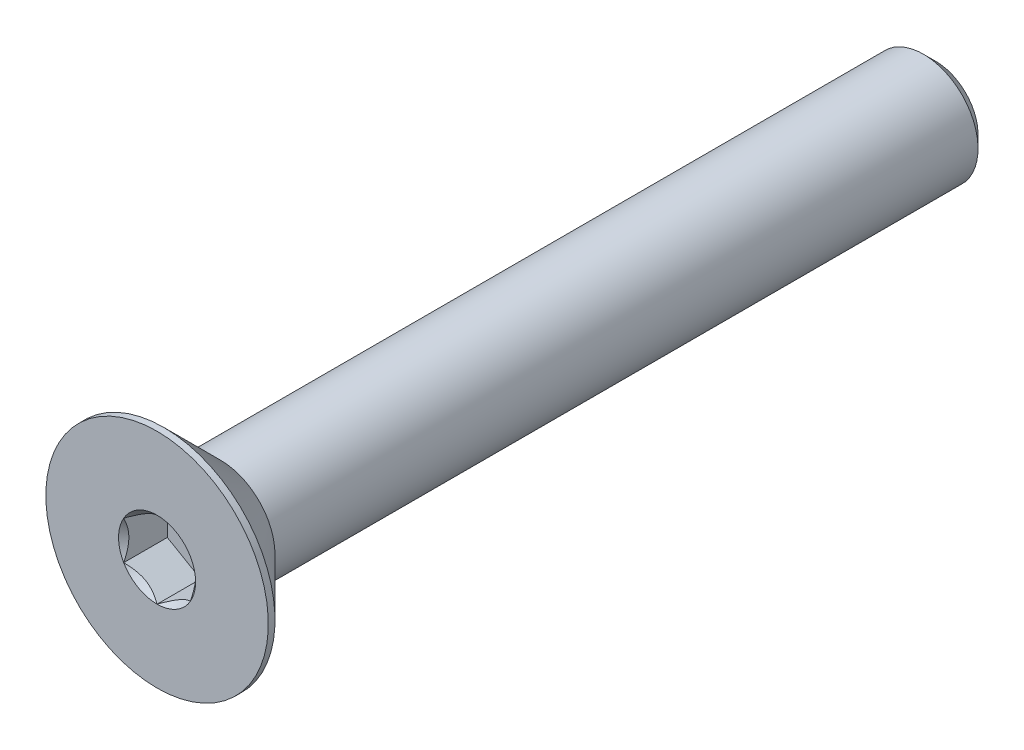
ISO-10303-21;
HEADER;
FILE_DESCRIPTION(('STEP AP214'),'2;1');
FILE_NAME('part.step','',(''),(''),'','','');
FILE_SCHEMA(('AUTOMOTIVE_DESIGN { 1 0 10303 214 1 1 1 1 }'));
ENDSEC;
DATA;
#1=APPLICATION_CONTEXT('core data for automotive mechanical design processes');
#2=APPLICATION_PROTOCOL_DEFINITION('international standard','automotive_design',2000,#1);
#3=PRODUCT_CONTEXT('',#1,'mechanical');
#4=PRODUCT('Part','Part','',(#3));
#5=PRODUCT_RELATED_PRODUCT_CATEGORY('part','',(#4));
#6=PRODUCT_DEFINITION_FORMATION('','',#4);
#7=PRODUCT_DEFINITION_CONTEXT('part definition',#1,'design');
#8=PRODUCT_DEFINITION('design','',#6,#7);
#9=PRODUCT_DEFINITION_SHAPE('','',#8);
#10=(LENGTH_UNIT() NAMED_UNIT(*) SI_UNIT(.MILLI.,.METRE.));
#11=(NAMED_UNIT(*) PLANE_ANGLE_UNIT() SI_UNIT($,.RADIAN.));
#12=(NAMED_UNIT(*) SI_UNIT($,.STERADIAN.) SOLID_ANGLE_UNIT());
#13=UNCERTAINTY_MEASURE_WITH_UNIT(LENGTH_MEASURE(1.E-05),#10,'distance_accuracy_value','');
#14=(GEOMETRIC_REPRESENTATION_CONTEXT(3) GLOBAL_UNCERTAINTY_ASSIGNED_CONTEXT((#13)) GLOBAL_UNIT_ASSIGNED_CONTEXT((#10,
#11,#12)) REPRESENTATION_CONTEXT('',''));
#15=CARTESIAN_POINT('',(0.,0.,0.));
#16=DIRECTION('',(0.,0.,1.));
#17=DIRECTION('',(1.,0.,0.));
#18=AXIS2_PLACEMENT_3D('',#15,#16,#17);
#19=CARTESIAN_POINT('',(0.,-1.73205080756888,-1.96));
#20=DIRECTION('',(0.5,-0.866025403784439,0.));
#21=DIRECTION('',(0.,0.,-1.));
#22=AXIS2_PLACEMENT_3D('',#19,#20,#21);
#23=PLANE('',#22);
#24=DIRECTION('',(0.,0.,1.));
#25=VECTOR('',#24,1.);
#26=CARTESIAN_POINT('',(0.,-1.73205080756888,-1.96));
#27=LINE('',#26,#25);
#28=CARTESIAN_POINT('',(0.,-1.73205080756888,-1.96));
#29=VERTEX_POINT('',#28);
#30=CARTESIAN_POINT('',(0.,-1.73205080756888,0.));
#31=VERTEX_POINT('',#30);
#32=EDGE_CURVE('E11',#29,#31,#27,.T.);
#33=ORIENTED_EDGE('',*,*,#32,.T.);
#34=CARTESIAN_POINT('',(0.,-1.73205080756888,0.));
#35=CARTESIAN_POINT('',(0.749999999999999,-1.29903810567666,-0.433012701892219));
#36=CARTESIAN_POINT('',(1.5,-0.86602540378444,0.));
#37=(BOUNDED_CURVE() B_SPLINE_CURVE(2,(#34,#35,#36),.UNSPECIFIED.,.F.,
.F.) B_SPLINE_CURVE_WITH_KNOTS((3,3),(-0.388312804292311,-0.130611113351457),
.UNSPECIFIED.) CURVE() GEOMETRIC_REPRESENTATION_ITEM() RATIONAL_B_SPLINE_CURVE((1.3094010767585,
1.51196612828742,1.3094010767585)) REPRESENTATION_ITEM(''));
#38=CARTESIAN_POINT('',(1.5,-0.86602540378444,0.));
#39=VERTEX_POINT('',#38);
#40=EDGE_CURVE('E161',#31,#39,#37,.T.);
#41=ORIENTED_EDGE('',*,*,#40,.T.);
#42=DIRECTION('',(0.,0.,1.));
#43=VECTOR('',#42,1.);
#44=CARTESIAN_POINT('',(1.5,-0.866025403784439,-1.96));
#45=LINE('',#44,#43);
#46=CARTESIAN_POINT('',(1.5,-0.866025403784439,-1.96));
#47=VERTEX_POINT('',#46);
#48=EDGE_CURVE('E84',#47,#39,#45,.T.);
#49=ORIENTED_EDGE('',*,*,#48,.F.);
#50=DIRECTION('',(0.866025403784439,0.5,0.));
#51=VECTOR('',#50,1.);
#52=CARTESIAN_POINT('',(0.,-1.73205080756888,-1.96));
#53=LINE('',#52,#51);
#54=EDGE_CURVE('E156',#29,#47,#53,.T.);
#55=ORIENTED_EDGE('',*,*,#54,.F.);
#56=EDGE_LOOP('',(#33,#41,#49,#55));
#57=FACE_BOUND('',#56,.T.);
#58=ADVANCED_FACE('F17',(#57),#23,.F.);
#59=CARTESIAN_POINT('',(-1.5,-0.866025403784438,-1.96));
#60=DIRECTION('',(-0.5,-0.866025403784439,0.));
#61=DIRECTION('',(-0.866025403784439,0.5,0.));
#62=AXIS2_PLACEMENT_3D('',#59,#60,#61);
#63=PLANE('',#62);
#64=DIRECTION('',(0.,0.,1.));
#65=VECTOR('',#64,1.);
#66=CARTESIAN_POINT('',(-1.5,-0.866025403784438,-1.96));
#67=LINE('',#66,#65);
#68=CARTESIAN_POINT('',(-1.5,-0.866025403784438,-1.96));
#69=VERTEX_POINT('',#68);
#70=CARTESIAN_POINT('',(-1.5,-0.866025403784438,0.));
#71=VERTEX_POINT('',#70);
#72=EDGE_CURVE('E29',#69,#71,#67,.T.);
#73=ORIENTED_EDGE('',*,*,#72,.T.);
#74=CARTESIAN_POINT('',(-1.5,-0.86602540378444,0.));
#75=CARTESIAN_POINT('',(-0.749999999999999,-1.29903810567666,-0.433012701892218));
#76=CARTESIAN_POINT('',(0.,-1.73205080756888,0.));
#77=(BOUNDED_CURVE() B_SPLINE_CURVE(2,(#74,#75,#76),.UNSPECIFIED.,.F.,
.F.) B_SPLINE_CURVE_WITH_KNOTS((3,3),(-0.388312804292311,-0.130611113351457),
.UNSPECIFIED.) CURVE() GEOMETRIC_REPRESENTATION_ITEM() RATIONAL_B_SPLINE_CURVE((1.3094010767585,
1.51196612828742,1.3094010767585)) REPRESENTATION_ITEM(''));
#78=EDGE_CURVE('E176',#71,#31,#77,.T.);
#79=ORIENTED_EDGE('',*,*,#78,.T.);
#80=ORIENTED_EDGE('',*,*,#32,.F.);
#81=DIRECTION('',(0.866025403784439,-0.5,0.));
#82=VECTOR('',#81,1.);
#83=CARTESIAN_POINT('',(-1.5,-0.866025403784438,-1.96));
#84=LINE('',#83,#82);
#85=EDGE_CURVE('E171',#69,#29,#84,.T.);
#86=ORIENTED_EDGE('',*,*,#85,.F.);
#87=EDGE_LOOP('',(#73,#79,#80,#86));
#88=FACE_BOUND('',#87,.T.);
#89=ADVANCED_FACE('F288',(#88),#63,.F.);
#90=CARTESIAN_POINT('',(-1.5,0.866025403784439,-1.96));
#91=DIRECTION('',(-1.,0.,0.));
#92=DIRECTION('',(0.,0.,1.));
#93=AXIS2_PLACEMENT_3D('',#90,#91,#92);
#94=PLANE('',#93);
#95=DIRECTION('',(0.,0.,1.));
#96=VECTOR('',#95,1.);
#97=CARTESIAN_POINT('',(-1.5,0.866025403784439,-1.96));
#98=LINE('',#97,#96);
#99=CARTESIAN_POINT('',(-1.5,0.866025403784439,-1.96));
#100=VERTEX_POINT('',#99);
#101=CARTESIAN_POINT('',(-1.5,0.86602540378444,0.));
#102=VERTEX_POINT('',#101);
#103=EDGE_CURVE('E198',#100,#102,#98,.T.);
#104=ORIENTED_EDGE('',*,*,#103,.T.);
#105=CARTESIAN_POINT('',(-1.5,0.866025403784437,0.));
#106=CARTESIAN_POINT('',(-1.5,0.,-0.433012701892218));
#107=CARTESIAN_POINT('',(-1.5,-0.866025403784438,0.));
#108=(BOUNDED_CURVE() B_SPLINE_CURVE(2,(#105,#106,#107),.UNSPECIFIED.,.F.,
.F.) B_SPLINE_CURVE_WITH_KNOTS((3,3),(-0.388312804292311,-0.130611113351457),
.UNSPECIFIED.) CURVE() GEOMETRIC_REPRESENTATION_ITEM() RATIONAL_B_SPLINE_CURVE((1.3094010767585,
1.51196612828742,1.3094010767585)) REPRESENTATION_ITEM(''));
#109=EDGE_CURVE('E210',#102,#71,#108,.T.);
#110=ORIENTED_EDGE('',*,*,#109,.T.);
#111=ORIENTED_EDGE('',*,*,#72,.F.);
#112=DIRECTION('',(0.,-1.,0.));
#113=VECTOR('',#112,1.);
#114=CARTESIAN_POINT('',(-1.5,0.866025403784439,-1.96));
#115=LINE('',#114,#113);
#116=EDGE_CURVE('E167',#100,#69,#115,.T.);
#117=ORIENTED_EDGE('',*,*,#116,.F.);
#118=EDGE_LOOP('',(#104,#110,#111,#117));
#119=FACE_BOUND('',#118,.T.);
#120=ADVANCED_FACE('F312',(#119),#94,.F.);
#121=CARTESIAN_POINT('',(0.,1.73205080756888,-1.96));
#122=DIRECTION('',(-0.5,0.866025403784439,0.));
#123=DIRECTION('',(0.,0.,1.));
#124=AXIS2_PLACEMENT_3D('',#121,#122,#123);
#125=PLANE('',#124);
#126=DIRECTION('',(0.,0.,1.));
#127=VECTOR('',#126,1.);
#128=CARTESIAN_POINT('',(0.,1.73205080756888,-1.96));
#129=LINE('',#128,#127);
#130=CARTESIAN_POINT('',(0.,1.73205080756888,-1.96));
#131=VERTEX_POINT('',#130);
#132=CARTESIAN_POINT('',(0.,1.73205080756888,0.));
#133=VERTEX_POINT('',#132);
#134=EDGE_CURVE('E201',#131,#133,#129,.T.);
#135=ORIENTED_EDGE('',*,*,#134,.T.);
#136=CARTESIAN_POINT('',(0.,1.73205080756888,0.));
#137=CARTESIAN_POINT('',(-0.75,1.29903810567666,-0.433012701892217));
#138=CARTESIAN_POINT('',(-1.5,0.86602540378444,0.));
#139=(BOUNDED_CURVE() B_SPLINE_CURVE(2,(#136,#137,#138),.UNSPECIFIED.,.F.,
.F.) B_SPLINE_CURVE_WITH_KNOTS((3,3),(-0.388312804292311,-0.130611113351457),
.UNSPECIFIED.) CURVE() GEOMETRIC_REPRESENTATION_ITEM() RATIONAL_B_SPLINE_CURVE((1.3094010767585,
1.51196612828741,1.3094010767585)) REPRESENTATION_ITEM(''));
#140=EDGE_CURVE('E204',#133,#102,#139,.T.);
#141=ORIENTED_EDGE('',*,*,#140,.T.);
#142=ORIENTED_EDGE('',*,*,#103,.F.);
#143=DIRECTION('',(-0.866025403784439,-0.5,0.));
#144=VECTOR('',#143,1.);
#145=CARTESIAN_POINT('',(0.,1.73205080756888,-1.96));
#146=LINE('',#145,#144);
#147=EDGE_CURVE('E166',#131,#100,#146,.T.);
#148=ORIENTED_EDGE('',*,*,#147,.F.);
#149=EDGE_LOOP('',(#135,#141,#142,#148));
#150=FACE_BOUND('',#149,.T.);
#151=ADVANCED_FACE('F310',(#150),#125,.F.);
#152=CARTESIAN_POINT('',(1.5,0.866025403784439,-1.96));
#153=DIRECTION('',(0.5,0.866025403784439,0.));
#154=DIRECTION('',(0.,0.,-1.));
#155=AXIS2_PLACEMENT_3D('',#152,#153,#154);
#156=PLANE('',#155);
#157=DIRECTION('',(0.,0.,1.));
#158=VECTOR('',#157,1.);
#159=CARTESIAN_POINT('',(1.5,0.866025403784439,-1.96));
#160=LINE('',#159,#158);
#161=CARTESIAN_POINT('',(1.5,0.866025403784439,-1.96));
#162=VERTEX_POINT('',#161);
#163=CARTESIAN_POINT('',(1.5,0.866025403784439,0.));
#164=VERTEX_POINT('',#163);
#165=EDGE_CURVE('E95',#162,#164,#160,.T.);
#166=ORIENTED_EDGE('',*,*,#165,.T.);
#167=CARTESIAN_POINT('',(1.5,0.86602540378444,0.));
#168=CARTESIAN_POINT('',(0.749999999999999,1.29903810567666,-0.433012701892218));
#169=CARTESIAN_POINT('',(0.,1.73205080756888,0.));
#170=(BOUNDED_CURVE() B_SPLINE_CURVE(2,(#167,#168,#169),.UNSPECIFIED.,.F.,
.F.) B_SPLINE_CURVE_WITH_KNOTS((3,3),(-0.388312804292311,-0.130611113351457),
.UNSPECIFIED.) CURVE() GEOMETRIC_REPRESENTATION_ITEM() RATIONAL_B_SPLINE_CURVE((1.3094010767585,
1.51196612828742,1.3094010767585)) REPRESENTATION_ITEM(''));
#171=EDGE_CURVE('E20',#164,#133,#170,.T.);
#172=ORIENTED_EDGE('',*,*,#171,.T.);
#173=ORIENTED_EDGE('',*,*,#134,.F.);
#174=DIRECTION('',(-0.866025403784439,0.5,0.));
#175=VECTOR('',#174,1.);
#176=CARTESIAN_POINT('',(1.5,0.866025403784439,-1.96));
#177=LINE('',#176,#175);
#178=EDGE_CURVE('E162',#162,#131,#177,.T.);
#179=ORIENTED_EDGE('',*,*,#178,.F.);
#180=EDGE_LOOP('',(#166,#172,#173,#179));
#181=FACE_BOUND('',#180,.T.);
#182=ADVANCED_FACE('F305',(#181),#156,.F.);
#183=CARTESIAN_POINT('',(1.5,-0.866025403784439,-1.96));
#184=DIRECTION('',(1.,0.,0.));
#185=DIRECTION('',(0.,-1.,0.));
#186=AXIS2_PLACEMENT_3D('',#183,#184,#185);
#187=PLANE('',#186);
#188=ORIENTED_EDGE('',*,*,#48,.T.);
#189=CARTESIAN_POINT('',(1.5,-0.866025403784438,0.));
#190=CARTESIAN_POINT('',(1.5,0.,-0.433012701892218));
#191=CARTESIAN_POINT('',(1.5,0.86602540378444,0.));
#192=(BOUNDED_CURVE() B_SPLINE_CURVE(2,(#189,#190,#191),.UNSPECIFIED.,.F.,
.F.) B_SPLINE_CURVE_WITH_KNOTS((3,3),(-0.388312804292311,-0.130611113351457),
.UNSPECIFIED.) CURVE() GEOMETRIC_REPRESENTATION_ITEM() RATIONAL_B_SPLINE_CURVE((1.3094010767585,
1.51196612828742,1.3094010767585)) REPRESENTATION_ITEM(''));
#193=EDGE_CURVE('E142',#39,#164,#192,.T.);
#194=ORIENTED_EDGE('',*,*,#193,.T.);
#195=ORIENTED_EDGE('',*,*,#165,.F.);
#196=DIRECTION('',(0.,1.,0.));
#197=VECTOR('',#196,1.);
#198=CARTESIAN_POINT('',(1.5,-0.866025403784439,-1.96));
#199=LINE('',#198,#197);
#200=EDGE_CURVE('E160',#47,#162,#199,.T.);
#201=ORIENTED_EDGE('',*,*,#200,.F.);
#202=EDGE_LOOP('',(#188,#194,#195,#201));
#203=FACE_BOUND('',#202,.T.);
#204=ADVANCED_FACE('F302',(#203),#187,.F.);
#205=CARTESIAN_POINT('',(1.5,-0.866025403784438,-1.96));
#206=DIRECTION('',(0.,0.,1.));
#207=DIRECTION('',(1.,0.,0.));
#208=AXIS2_PLACEMENT_3D('',#205,#206,#207);
#209=PLANE('',#208);
#210=ORIENTED_EDGE('',*,*,#54,.T.);
#211=ORIENTED_EDGE('',*,*,#200,.T.);
#212=ORIENTED_EDGE('',*,*,#178,.T.);
#213=ORIENTED_EDGE('',*,*,#147,.T.);
#214=ORIENTED_EDGE('',*,*,#116,.T.);
#215=ORIENTED_EDGE('',*,*,#85,.T.);
#216=EDGE_LOOP('',(#210,#211,#212,#213,#214,#215));
#217=FACE_BOUND('',#216,.T.);
#218=ADVANCED_FACE('F280',(#217),#209,.T.);
#219=CARTESIAN_POINT('',(0.,0.,0.));
#220=DIRECTION('',(0.,0.,1.));
#221=DIRECTION('',(1.,0.,0.));
#222=AXIS2_PLACEMENT_3D('',#219,#220,#221);
#223=CONICAL_SURFACE('',#222,1.73205080756888,0.78539816339745);
#224=CARTESIAN_POINT('',(0.,0.,0.));
#225=DIRECTION('',(0.,0.,1.));
#226=DIRECTION('',(1.,0.,0.));
#227=AXIS2_PLACEMENT_3D('',#224,#225,#226);
#228=CIRCLE('',#227,1.73205080756888);
#229=EDGE_CURVE('E132',#31,#39,#228,.T.);
#230=ORIENTED_EDGE('',*,*,#229,.T.);
#231=ORIENTED_EDGE('',*,*,#40,.F.);
#232=EDGE_LOOP('',(#230,#231));
#233=FACE_BOUND('',#232,.T.);
#234=ADVANCED_FACE('F284',(#233),#223,.F.);
#235=CARTESIAN_POINT('',(0.,0.,0.));
#236=DIRECTION('',(0.,0.,1.));
#237=DIRECTION('',(1.,0.,0.));
#238=AXIS2_PLACEMENT_3D('',#235,#236,#237);
#239=CONICAL_SURFACE('',#238,1.73205080756888,0.78539816339745);
#240=CARTESIAN_POINT('',(0.,0.,0.));
#241=DIRECTION('',(0.,0.,1.));
#242=DIRECTION('',(1.,0.,0.));
#243=AXIS2_PLACEMENT_3D('',#240,#241,#242);
#244=CIRCLE('',#243,1.73205080756888);
#245=EDGE_CURVE('E190',#71,#31,#244,.T.);
#246=ORIENTED_EDGE('',*,*,#245,.T.);
#247=ORIENTED_EDGE('',*,*,#78,.F.);
#248=EDGE_LOOP('',(#246,#247));
#249=FACE_BOUND('',#248,.T.);
#250=ADVANCED_FACE('F291',(#249),#239,.F.);
#251=CARTESIAN_POINT('',(0.,0.,0.));
#252=DIRECTION('',(0.,0.,1.));
#253=DIRECTION('',(-1.,0.,0.));
#254=AXIS2_PLACEMENT_3D('',#251,#252,#253);
#255=CONICAL_SURFACE('',#254,1.73205080756888,0.78539816339745);
#256=CARTESIAN_POINT('',(0.,0.,0.));
#257=DIRECTION('',(0.,0.,1.));
#258=DIRECTION('',(1.,0.,0.));
#259=AXIS2_PLACEMENT_3D('',#256,#257,#258);
#260=CIRCLE('',#259,1.73205080756888);
#261=EDGE_CURVE('E185',#102,#71,#260,.T.);
#262=ORIENTED_EDGE('',*,*,#261,.T.);
#263=ORIENTED_EDGE('',*,*,#109,.F.);
#264=EDGE_LOOP('',(#262,#263));
#265=FACE_BOUND('',#264,.T.);
#266=ADVANCED_FACE('F393',(#265),#255,.F.);
#267=CARTESIAN_POINT('',(0.,0.,0.));
#268=DIRECTION('',(0.,0.,1.));
#269=DIRECTION('',(1.,0.,0.));
#270=AXIS2_PLACEMENT_3D('',#267,#268,#269);
#271=CONICAL_SURFACE('',#270,1.73205080756888,0.78539816339745);
#272=CARTESIAN_POINT('',(0.,0.,0.));
#273=DIRECTION('',(0.,0.,1.));
#274=DIRECTION('',(1.,0.,0.));
#275=AXIS2_PLACEMENT_3D('',#272,#273,#274);
#276=CIRCLE('',#275,1.73205080756888);
#277=EDGE_CURVE('E189',#133,#102,#276,.T.);
#278=ORIENTED_EDGE('',*,*,#277,.T.);
#279=ORIENTED_EDGE('',*,*,#140,.F.);
#280=EDGE_LOOP('',(#278,#279));
#281=FACE_BOUND('',#280,.T.);
#282=ADVANCED_FACE('F403',(#281),#271,.F.);
#283=CARTESIAN_POINT('',(0.,0.,0.));
#284=DIRECTION('',(0.,0.,1.));
#285=DIRECTION('',(1.,0.,0.));
#286=AXIS2_PLACEMENT_3D('',#283,#284,#285);
#287=CONICAL_SURFACE('',#286,1.73205080756888,0.78539816339745);
#288=CARTESIAN_POINT('',(0.,0.,0.));
#289=DIRECTION('',(0.,0.,1.));
#290=DIRECTION('',(1.,0.,0.));
#291=AXIS2_PLACEMENT_3D('',#288,#289,#290);
#292=CIRCLE('',#291,1.73205080756888);
#293=EDGE_CURVE('E154',#164,#133,#292,.T.);
#294=ORIENTED_EDGE('',*,*,#293,.T.);
#295=ORIENTED_EDGE('',*,*,#171,.F.);
#296=EDGE_LOOP('',(#294,#295));
#297=FACE_BOUND('',#296,.T.);
#298=ADVANCED_FACE('F414',(#297),#287,.F.);
#299=CARTESIAN_POINT('',(0.,-2.5,0.));
#300=DIRECTION('',(0.,0.,1.));
#301=DIRECTION('',(0.,-1.,0.));
#302=AXIS2_PLACEMENT_3D('',#299,#300,#301);
#303=PLANE('',#302);
#304=ORIENTED_EDGE('',*,*,#229,.F.);
#305=ORIENTED_EDGE('',*,*,#245,.F.);
#306=ORIENTED_EDGE('',*,*,#261,.F.);
#307=ORIENTED_EDGE('',*,*,#277,.F.);
#308=ORIENTED_EDGE('',*,*,#293,.F.);
#309=CARTESIAN_POINT('',(0.,0.,0.));
#310=DIRECTION('',(0.,0.,1.));
#311=DIRECTION('',(1.,0.,0.));
#312=AXIS2_PLACEMENT_3D('',#309,#310,#311);
#313=CIRCLE('',#312,1.73205080756888);
#314=EDGE_CURVE('E149',#39,#164,#313,.T.);
#315=ORIENTED_EDGE('',*,*,#314,.F.);
#316=EDGE_LOOP('',(#304,#305,#306,#307,#308,#315));
#317=FACE_BOUND('',#316,.T.);
#318=CARTESIAN_POINT('',(0.,0.,0.));
#319=DIRECTION('',(0.,0.,1.));
#320=DIRECTION('',(0.,-1.,0.));
#321=AXIS2_PLACEMENT_3D('',#318,#319,#320);
#322=CIRCLE('',#321,5.);
#323=CARTESIAN_POINT('',(0.,5.,0.));
#324=VERTEX_POINT('',#323);
#325=EDGE_CURVE('E130',#324,#324,#322,.T.);
#326=ORIENTED_EDGE('',*,*,#325,.T.);
#327=EDGE_LOOP('',(#326));
#328=FACE_BOUND('',#327,.T.);
#329=ADVANCED_FACE('F294',(#317,#328),#303,.T.);
#330=CARTESIAN_POINT('',(0.,-2.5,-35.));
#331=DIRECTION('',(0.,0.,-1.));
#332=DIRECTION('',(0.,-1.,0.));
#333=AXIS2_PLACEMENT_3D('',#330,#331,#332);
#334=PLANE('',#333);
#335=CARTESIAN_POINT('',(0.,0.,-35.));
#336=DIRECTION('',(0.,0.,-1.));
#337=DIRECTION('',(1.,0.,0.));
#338=AXIS2_PLACEMENT_3D('',#335,#336,#337);
#339=CIRCLE('',#338,1.9);
#340=CARTESIAN_POINT('',(-1.9,0.,-35.));
#341=VERTEX_POINT('',#340);
#342=EDGE_CURVE('E246',#341,#341,#339,.T.);
#343=ORIENTED_EDGE('',*,*,#342,.T.);
#344=EDGE_LOOP('',(#343));
#345=FACE_BOUND('',#344,.T.);
#346=ADVANCED_FACE('F435',(#345),#334,.T.);
#347=CARTESIAN_POINT('',(0.,0.,0.));
#348=DIRECTION('',(0.,0.,1.));
#349=DIRECTION('',(0.,-1.,0.));
#350=AXIS2_PLACEMENT_3D('',#347,#348,#349);
#351=CYLINDRICAL_SURFACE('',#350,5.);
#352=ORIENTED_EDGE('',*,*,#325,.F.);
#353=DIRECTION('',(0.,0.,-1.));
#354=VECTOR('',#353,1.);
#355=CARTESIAN_POINT('',(0.,5.,0.));
#356=LINE('',#355,#354);
#357=CARTESIAN_POINT('',(0.,5.,-0.300000000000012));
#358=VERTEX_POINT('',#357);
#359=EDGE_CURVE('E124',#324,#358,#356,.T.);
#360=ORIENTED_EDGE('',*,*,#359,.T.);
#361=CARTESIAN_POINT('',(0.,0.,-0.300000000000008));
#362=DIRECTION('',(0.,0.,1.));
#363=DIRECTION('',(0.,-1.,0.));
#364=AXIS2_PLACEMENT_3D('',#361,#362,#363);
#365=CIRCLE('',#364,5.);
#366=EDGE_CURVE('E128',#358,#358,#365,.T.);
#367=ORIENTED_EDGE('',*,*,#366,.T.);
#368=ORIENTED_EDGE('',*,*,#359,.F.);
#369=EDGE_LOOP('',(#352,#360,#367,#368));
#370=FACE_BOUND('',#369,.T.);
#371=ADVANCED_FACE('F126',(#370),#351,.T.);
#372=CARTESIAN_POINT('',(0.,0.,0.));
#373=DIRECTION('',(0.,0.,1.));
#374=DIRECTION('',(1.,0.,0.));
#375=AXIS2_PLACEMENT_3D('',#372,#373,#374);
#376=CONICAL_SURFACE('',#375,1.73205080756888,0.78539816339745);
#377=ORIENTED_EDGE('',*,*,#193,.F.);
#378=ORIENTED_EDGE('',*,*,#314,.T.);
#379=EDGE_LOOP('',(#377,#378));
#380=FACE_BOUND('',#379,.T.);
#381=ADVANCED_FACE('F301',(#380),#376,.F.);
#382=CARTESIAN_POINT('',(0.,0.,-2.8));
#383=DIRECTION('',(0.,0.,1.));
#384=DIRECTION('',(0.,-1.,0.));
#385=AXIS2_PLACEMENT_3D('',#382,#383,#384);
#386=CONICAL_SURFACE('',#385,2.5,0.78539816339745);
#387=ORIENTED_EDGE('',*,*,#366,.F.);
#388=DIRECTION('',(0.,-0.707106781186549,-0.707106781186546));
#389=VECTOR('',#388,1.);
#390=CARTESIAN_POINT('',(0.,2.5,-2.8));
#391=LINE('',#390,#389);
#392=CARTESIAN_POINT('',(0.,2.4505,-2.8495));
#393=VERTEX_POINT('',#392);
#394=EDGE_CURVE('E136',#358,#393,#391,.T.);
#395=ORIENTED_EDGE('',*,*,#394,.T.);
#396=CARTESIAN_POINT('',(0.,0.,-2.8495));
#397=DIRECTION('',(0.,0.,1.));
#398=DIRECTION('',(0.,1.,0.));
#399=AXIS2_PLACEMENT_3D('',#396,#397,#398);
#400=CIRCLE('',#399,2.4505);
#401=CARTESIAN_POINT('',(0.,-2.4505,-2.8495));
#402=VERTEX_POINT('',#401);
#403=EDGE_CURVE('E194',#393,#402,#400,.T.);
#404=ORIENTED_EDGE('',*,*,#403,.T.);
#405=CARTESIAN_POINT('',(0.,0.,-2.8495));
#406=DIRECTION('',(0.,0.,1.));
#407=DIRECTION('',(0.,1.,0.));
#408=AXIS2_PLACEMENT_3D('',#405,#406,#407);
#409=CIRCLE('',#408,2.4505);
#410=EDGE_CURVE('E139',#402,#393,#409,.T.);
#411=ORIENTED_EDGE('',*,*,#410,.T.);
#412=ORIENTED_EDGE('',*,*,#394,.F.);
#413=EDGE_LOOP('',(#387,#395,#404,#411,#412));
#414=FACE_BOUND('',#413,.T.);
#415=ADVANCED_FACE('F137',(#414),#386,.T.);
#416=CARTESIAN_POINT('',(0.,0.,-35.));
#417=DIRECTION('',(0.,0.,-1.));
#418=DIRECTION('',(0.,1.,0.));
#419=AXIS2_PLACEMENT_3D('',#416,#417,#418);
#420=CYLINDRICAL_SURFACE('',#419,2.4505);
#421=CARTESIAN_POINT('',(0.,0.,-34.4495));
#422=DIRECTION('',(0.,0.,1.));
#423=DIRECTION('',(0.,1.,0.));
#424=AXIS2_PLACEMENT_3D('',#421,#422,#423);
#425=CIRCLE('',#424,2.4505);
#426=CARTESIAN_POINT('',(0.,-2.4505,-34.4495));
#427=VERTEX_POINT('',#426);
#428=CARTESIAN_POINT('',(-2.4505,0.,-34.4495));
#429=VERTEX_POINT('',#428);
#430=EDGE_CURVE('E241',#427,#429,#425,.T.);
#431=ORIENTED_EDGE('',*,*,#430,.T.);
#432=CARTESIAN_POINT('',(0.,0.,-34.4495));
#433=DIRECTION('',(0.,0.,1.));
#434=DIRECTION('',(0.,1.,0.));
#435=AXIS2_PLACEMENT_3D('',#432,#433,#434);
#436=CIRCLE('',#435,2.4505);
#437=EDGE_CURVE('E234',#429,#427,#436,.T.);
#438=ORIENTED_EDGE('',*,*,#437,.T.);
#439=DIRECTION('',(0.,0.,1.));
#440=VECTOR('',#439,1.);
#441=CARTESIAN_POINT('',(0.,-2.4505,-35.));
#442=LINE('',#441,#440);
#443=EDGE_CURVE('E197',#427,#402,#442,.T.);
#444=ORIENTED_EDGE('',*,*,#443,.T.);
#445=ORIENTED_EDGE('',*,*,#403,.F.);
#446=ORIENTED_EDGE('',*,*,#410,.F.);
#447=ORIENTED_EDGE('',*,*,#443,.F.);
#448=EDGE_LOOP('',(#431,#438,#444,#445,#446,#447));
#449=FACE_BOUND('',#448,.T.);
#450=ADVANCED_FACE('F472',(#449),#420,.T.);
#451=CARTESIAN_POINT('',(0.,0.,-34.7));
#452=DIRECTION('',(0.,0.,1.));
#453=DIRECTION('',(1.,0.,0.));
#454=AXIS2_PLACEMENT_3D('',#451,#452,#453);
#455=CONICAL_SURFACE('',#454,2.2,0.785398163397454);
#456=ORIENTED_EDGE('',*,*,#342,.F.);
#457=DIRECTION('',(-0.707106781186552,0.,0.707106781186543));
#458=VECTOR('',#457,1.);
#459=CARTESIAN_POINT('',(-2.2,0.,-34.7));
#460=LINE('',#459,#458);
#461=EDGE_CURVE('E249',#341,#429,#460,.T.);
#462=ORIENTED_EDGE('',*,*,#461,.T.);
#463=ORIENTED_EDGE('',*,*,#430,.F.);
#464=ORIENTED_EDGE('',*,*,#437,.F.);
#465=ORIENTED_EDGE('',*,*,#461,.F.);
#466=EDGE_LOOP('',(#456,#462,#463,#464,#465));
#467=FACE_BOUND('',#466,.T.);
#468=ADVANCED_FACE('F482',(#467),#455,.T.);
#469=CLOSED_SHELL('',(#58,#89,#120,#151,#182,#204,#218,#234,#250,#266,#282,#298,#329,#346,#371,
#381,#415,#450,#468));
#470=MANIFOLD_SOLID_BREP('B1',#469);
#471=ADVANCED_BREP_SHAPE_REPRESENTATION('',(#18,#470),#14);
#472=SHAPE_DEFINITION_REPRESENTATION(#9,#471);
ENDSEC;
END-ISO-10303-21;
